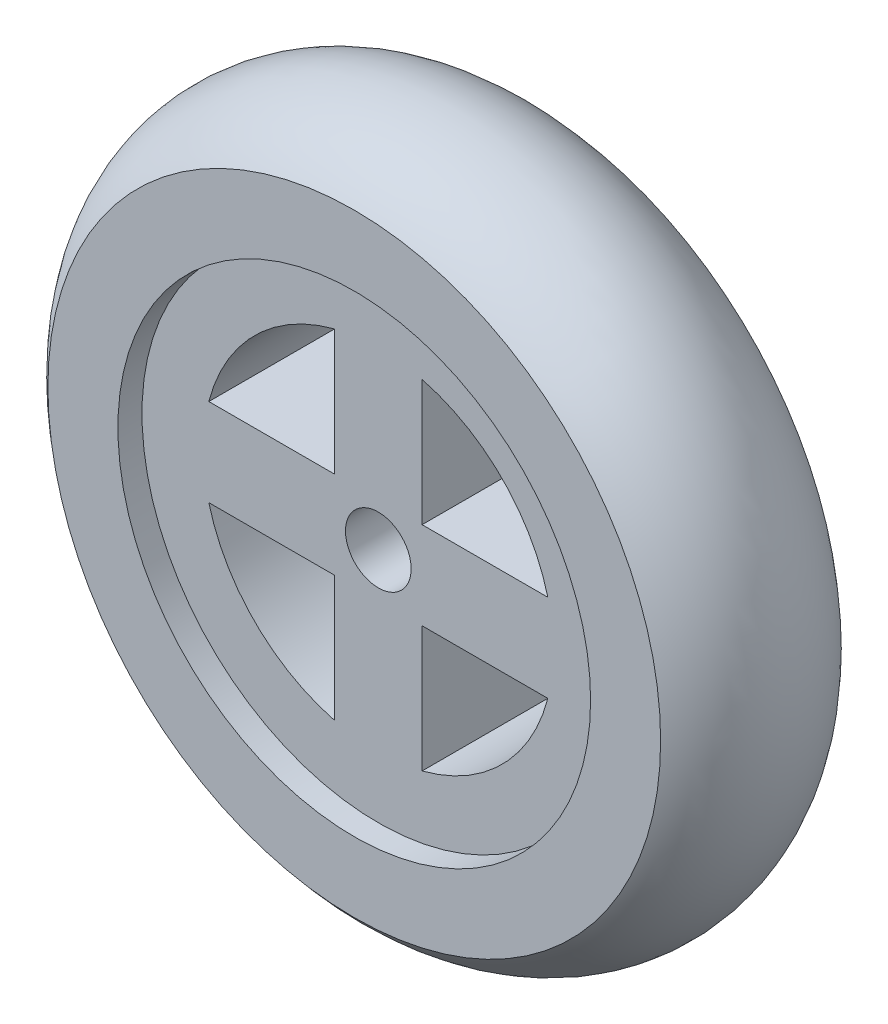
ISO-10303-21;
HEADER;
FILE_DESCRIPTION(('STEP AP214'),'2;1');
FILE_NAME('part.step','',(''),(''),'','','');
FILE_SCHEMA(('AUTOMOTIVE_DESIGN { 1 0 10303 214 1 1 1 1 }'));
ENDSEC;
DATA;
#1=APPLICATION_CONTEXT('core data for automotive mechanical design processes');
#2=APPLICATION_PROTOCOL_DEFINITION('international standard','automotive_design',2000,#1);
#3=PRODUCT_CONTEXT('',#1,'mechanical');
#4=PRODUCT('Part','Part','',(#3));
#5=PRODUCT_RELATED_PRODUCT_CATEGORY('part','',(#4));
#6=PRODUCT_DEFINITION_FORMATION('','',#4);
#7=PRODUCT_DEFINITION_CONTEXT('part definition',#1,'design');
#8=PRODUCT_DEFINITION('design','',#6,#7);
#9=PRODUCT_DEFINITION_SHAPE('','',#8);
#10=(LENGTH_UNIT() NAMED_UNIT(*) SI_UNIT(.MILLI.,.METRE.));
#11=(NAMED_UNIT(*) PLANE_ANGLE_UNIT() SI_UNIT($,.RADIAN.));
#12=(NAMED_UNIT(*) SI_UNIT($,.STERADIAN.) SOLID_ANGLE_UNIT());
#13=UNCERTAINTY_MEASURE_WITH_UNIT(LENGTH_MEASURE(1.E-05),#10,'distance_accuracy_value','');
#14=(GEOMETRIC_REPRESENTATION_CONTEXT(3) GLOBAL_UNCERTAINTY_ASSIGNED_CONTEXT((#13)) GLOBAL_UNIT_ASSIGNED_CONTEXT((#10,
#11,#12)) REPRESENTATION_CONTEXT('',''));
#15=CARTESIAN_POINT('',(0.,0.,0.));
#16=DIRECTION('',(0.,0.,1.));
#17=DIRECTION('',(1.,0.,0.));
#18=AXIS2_PLACEMENT_3D('',#15,#16,#17);
#19=CARTESIAN_POINT('',(2.54688017204094E-12,0.,729.455473155936));
#20=DIRECTION('',(0.,0.,1.));
#21=DIRECTION('',(1.,0.,0.));
#22=AXIS2_PLACEMENT_3D('',#19,#20,#21);
#23=CYLINDRICAL_SURFACE('',#22,40.);
#24=CARTESIAN_POINT('',(0.,0.,15.0000000000001));
#25=DIRECTION('',(0.,0.,1.));
#26=DIRECTION('',(1.,0.,0.));
#27=AXIS2_PLACEMENT_3D('',#24,#25,#26);
#28=CIRCLE('',#27,39.9999999999999);
#29=CARTESIAN_POINT('',(38.7298334620742,10.,15.));
#30=VERTEX_POINT('',#29);
#31=CARTESIAN_POINT('',(9.99999999999993,38.7298334620741,15.0000000000001));
#32=VERTEX_POINT('',#31);
#33=EDGE_CURVE('E130',#30,#32,#28,.T.);
#34=ORIENTED_EDGE('',*,*,#33,.T.);
#35=DIRECTION('',(0.,0.,1.));
#36=VECTOR('',#35,1.);
#37=CARTESIAN_POINT('',(10.0000000000024,38.7298334620742,729.455473155936));
#38=LINE('',#37,#36);
#39=CARTESIAN_POINT('',(9.99999999999982,38.7298334620743,-14.9999999999999));
#40=VERTEX_POINT('',#39);
#41=EDGE_CURVE('E165',#32,#40,#38,.F.);
#42=ORIENTED_EDGE('',*,*,#41,.T.);
#43=CARTESIAN_POINT('',(0.,0.,-14.9999999999999));
#44=DIRECTION('',(0.,0.,1.));
#45=DIRECTION('',(1.,0.,0.));
#46=AXIS2_PLACEMENT_3D('',#43,#44,#45);
#47=CIRCLE('',#46,40.0000000000001);
#48=CARTESIAN_POINT('',(38.7298334620742,10.,-15.));
#49=VERTEX_POINT('',#48);
#50=EDGE_CURVE('E212',#49,#40,#47,.T.);
#51=ORIENTED_EDGE('',*,*,#50,.F.);
#52=DIRECTION('',(0.,0.,1.));
#53=VECTOR('',#52,1.);
#54=CARTESIAN_POINT('',(38.7298334620767,10.,729.455473155935));
#55=LINE('',#54,#53);
#56=EDGE_CURVE('E188',#49,#30,#55,.T.);
#57=ORIENTED_EDGE('',*,*,#56,.T.);
#58=EDGE_LOOP('',(#34,#42,#51,#57));
#59=FACE_BOUND('',#58,.T.);
#60=ADVANCED_FACE('F32',(#59),#23,.F.);
#61=CARTESIAN_POINT('',(10.0000000000001,-38.7298334620742,-14.9999999999999));
#62=VERTEX_POINT('',#61);
#63=CARTESIAN_POINT('',(38.7298334620742,-10.,-15.));
#64=VERTEX_POINT('',#63);
#65=EDGE_CURVE('E48',#62,#64,#47,.T.);
#66=ORIENTED_EDGE('',*,*,#65,.F.);
#67=DIRECTION('',(0.,0.,1.));
#68=VECTOR('',#67,1.);
#69=CARTESIAN_POINT('',(10.0000000000027,-38.7298334620741,729.455473155936));
#70=LINE('',#69,#68);
#71=CARTESIAN_POINT('',(10.0000000000002,-38.7298334620741,15.0000000000001));
#72=VERTEX_POINT('',#71);
#73=EDGE_CURVE('E163',#62,#72,#70,.T.);
#74=ORIENTED_EDGE('',*,*,#73,.T.);
#75=CARTESIAN_POINT('',(38.7298334620742,-10.,15.));
#76=VERTEX_POINT('',#75);
#77=EDGE_CURVE('E128',#72,#76,#28,.T.);
#78=ORIENTED_EDGE('',*,*,#77,.T.);
#79=DIRECTION('',(0.,0.,1.));
#80=VECTOR('',#79,1.);
#81=CARTESIAN_POINT('',(38.7298334620767,-10.,729.455473155935));
#82=LINE('',#81,#80);
#83=EDGE_CURVE('E182',#64,#76,#82,.T.);
#84=ORIENTED_EDGE('',*,*,#83,.F.);
#85=EDGE_LOOP('',(#66,#74,#78,#84));
#86=FACE_BOUND('',#85,.T.);
#87=ADVANCED_FACE('F226',(#86),#23,.F.);
#88=CARTESIAN_POINT('',(0.,10.,0.));
#89=DIRECTION('',(0.,-1.,0.));
#90=DIRECTION('',(0.,0.,-1.));
#91=AXIS2_PLACEMENT_3D('',#88,#89,#90);
#92=PLANE('',#91);
#93=DIRECTION('',(0.,0.,-1.));
#94=VECTOR('',#93,1.);
#95=CARTESIAN_POINT('',(9.99999999999997,10.,0.));
#96=LINE('',#95,#94);
#97=CARTESIAN_POINT('',(10.,10.,15.0000000000001));
#98=VERTEX_POINT('',#97);
#99=CARTESIAN_POINT('',(9.99999999999991,10.,-14.9999999999999));
#100=VERTEX_POINT('',#99);
#101=EDGE_CURVE('E161',#98,#100,#96,.T.);
#102=ORIENTED_EDGE('',*,*,#101,.F.);
#103=DIRECTION('',(1.,0.,0.));
#104=VECTOR('',#103,1.);
#105=CARTESIAN_POINT('',(40.0000000000001,10.,15.));
#106=LINE('',#105,#104);
#107=EDGE_CURVE('E172',#98,#30,#106,.T.);
#108=ORIENTED_EDGE('',*,*,#107,.T.);
#109=ORIENTED_EDGE('',*,*,#56,.F.);
#110=DIRECTION('',(-1.,0.,0.));
#111=VECTOR('',#110,1.);
#112=CARTESIAN_POINT('',(-40.0000000000001,10.,-14.9999999999998));
#113=LINE('',#112,#111);
#114=EDGE_CURVE('E173',#49,#100,#113,.T.);
#115=ORIENTED_EDGE('',*,*,#114,.T.);
#116=EDGE_LOOP('',(#102,#108,#109,#115));
#117=FACE_BOUND('',#116,.T.);
#118=ADVANCED_FACE('F303',(#117),#92,.F.);
#119=CARTESIAN_POINT('',(0.,-10.,0.));
#120=DIRECTION('',(0.,-1.,0.));
#121=DIRECTION('',(0.,0.,-1.));
#122=AXIS2_PLACEMENT_3D('',#119,#120,#121);
#123=PLANE('',#122);
#124=DIRECTION('',(1.,0.,0.));
#125=VECTOR('',#124,1.);
#126=CARTESIAN_POINT('',(40.0000000000001,-10.,15.));
#127=LINE('',#126,#125);
#128=CARTESIAN_POINT('',(10.,-10.,15.0000000000001));
#129=VERTEX_POINT('',#128);
#130=EDGE_CURVE('E167',#129,#76,#127,.T.);
#131=ORIENTED_EDGE('',*,*,#130,.F.);
#132=DIRECTION('',(0.,0.,-1.));
#133=VECTOR('',#132,1.);
#134=CARTESIAN_POINT('',(10.,-10.,0.));
#135=LINE('',#134,#133);
#136=CARTESIAN_POINT('',(10.,-10.,-14.9999999999999));
#137=VERTEX_POINT('',#136);
#138=EDGE_CURVE('E11',#129,#137,#135,.T.);
#139=ORIENTED_EDGE('',*,*,#138,.T.);
#140=DIRECTION('',(-1.,0.,0.));
#141=VECTOR('',#140,1.);
#142=CARTESIAN_POINT('',(-40.0000000000001,-10.,-14.9999999999998));
#143=LINE('',#142,#141);
#144=EDGE_CURVE('E178',#64,#137,#143,.T.);
#145=ORIENTED_EDGE('',*,*,#144,.F.);
#146=ORIENTED_EDGE('',*,*,#83,.T.);
#147=EDGE_LOOP('',(#131,#139,#145,#146));
#148=FACE_BOUND('',#147,.T.);
#149=ADVANCED_FACE('F230',(#148),#123,.T.);
#150=DIRECTION('',(0.,0.,1.));
#151=VECTOR('',#150,1.);
#152=CARTESIAN_POINT('',(-9.99999999999758,38.7298334620741,729.455473155936));
#153=LINE('',#152,#151);
#154=CARTESIAN_POINT('',(-10.0000000000001,38.7298334620741,15.0000000000002));
#155=VERTEX_POINT('',#154);
#156=CARTESIAN_POINT('',(-10.0000000000002,38.7298334620742,-14.9999999999998));
#157=VERTEX_POINT('',#156);
#158=EDGE_CURVE('E139',#155,#157,#153,.F.);
#159=ORIENTED_EDGE('',*,*,#158,.F.);
#160=CARTESIAN_POINT('',(-38.7298334620741,10.,15.0000000000003));
#161=VERTEX_POINT('',#160);
#162=EDGE_CURVE('E127',#155,#161,#28,.T.);
#163=ORIENTED_EDGE('',*,*,#162,.T.);
#164=DIRECTION('',(0.,0.,1.));
#165=VECTOR('',#164,1.);
#166=CARTESIAN_POINT('',(-38.7298334620716,10.,729.455473155936));
#167=LINE('',#166,#165);
#168=CARTESIAN_POINT('',(-38.7298334620743,10.,-14.9999999999998));
#169=VERTEX_POINT('',#168);
#170=EDGE_CURVE('E185',#161,#169,#167,.F.);
#171=ORIENTED_EDGE('',*,*,#170,.T.);
#172=EDGE_CURVE('E211',#157,#169,#47,.T.);
#173=ORIENTED_EDGE('',*,*,#172,.F.);
#174=EDGE_LOOP('',(#159,#163,#171,#173));
#175=FACE_BOUND('',#174,.T.);
#176=ADVANCED_FACE('F304',(#175),#23,.F.);
#177=DIRECTION('',(0.,0.,1.));
#178=VECTOR('',#177,1.);
#179=CARTESIAN_POINT('',(-9.99999999999732,-38.7298334620742,729.455473155936));
#180=LINE('',#179,#178);
#181=CARTESIAN_POINT('',(-9.99999999999993,-38.7298334620743,-14.9999999999999));
#182=VERTEX_POINT('',#181);
#183=CARTESIAN_POINT('',(-9.99999999999981,-38.7298334620741,15.0000000000002));
#184=VERTEX_POINT('',#183);
#185=EDGE_CURVE('E56',#182,#184,#180,.T.);
#186=ORIENTED_EDGE('',*,*,#185,.F.);
#187=CARTESIAN_POINT('',(-38.7298334620743,-10.,-14.9999999999998));
#188=VERTEX_POINT('',#187);
#189=EDGE_CURVE('E209',#188,#182,#47,.T.);
#190=ORIENTED_EDGE('',*,*,#189,.F.);
#191=DIRECTION('',(0.,0.,1.));
#192=VECTOR('',#191,1.);
#193=CARTESIAN_POINT('',(-38.7298334620716,-10.,729.455473155936));
#194=LINE('',#193,#192);
#195=CARTESIAN_POINT('',(-38.7298334620741,-10.,15.0000000000003));
#196=VERTEX_POINT('',#195);
#197=EDGE_CURVE('E122',#196,#188,#194,.F.);
#198=ORIENTED_EDGE('',*,*,#197,.F.);
#199=EDGE_CURVE('E120',#196,#184,#28,.T.);
#200=ORIENTED_EDGE('',*,*,#199,.T.);
#201=EDGE_LOOP('',(#186,#190,#198,#200));
#202=FACE_BOUND('',#201,.T.);
#203=ADVANCED_FACE('F34',(#202),#23,.F.);
#204=CARTESIAN_POINT('',(40.,0.,-15.));
#205=DIRECTION('',(0.,0.,-1.));
#206=DIRECTION('',(-1.,0.,0.));
#207=AXIS2_PLACEMENT_3D('',#204,#205,#206);
#208=PLANE('',#207);
#209=CARTESIAN_POINT('',(0.,0.,-14.9999999999998));
#210=DIRECTION('',(0.,0.,-1.));
#211=DIRECTION('',(-1.,0.,0.));
#212=AXIS2_PLACEMENT_3D('',#209,#210,#211);
#213=CIRCLE('',#212,7.5);
#214=CARTESIAN_POINT('',(-7.50000000000005,0.,-14.9999999999998));
#215=VERTEX_POINT('',#214);
#216=EDGE_CURVE('E240',#215,#215,#213,.T.);
#217=ORIENTED_EDGE('',*,*,#216,.F.);
#218=EDGE_LOOP('',(#217));
#219=FACE_BOUND('',#218,.T.);
#220=ORIENTED_EDGE('',*,*,#50,.T.);
#221=DIRECTION('',(0.,-1.,0.));
#222=VECTOR('',#221,1.);
#223=CARTESIAN_POINT('',(10.0000000000001,-40.,-15.));
#224=LINE('',#223,#222);
#225=EDGE_CURVE('E149',#40,#100,#224,.T.);
#226=ORIENTED_EDGE('',*,*,#225,.T.);
#227=ORIENTED_EDGE('',*,*,#114,.F.);
#228=EDGE_LOOP('',(#220,#226,#227));
#229=FACE_BOUND('',#228,.T.);
#230=ORIENTED_EDGE('',*,*,#189,.T.);
#231=DIRECTION('',(0.,-1.,0.));
#232=VECTOR('',#231,1.);
#233=CARTESIAN_POINT('',(-9.99999999999991,-40.,-14.9999999999999));
#234=LINE('',#233,#232);
#235=CARTESIAN_POINT('',(-10.,-10.,-14.9999999999999));
#236=VERTEX_POINT('',#235);
#237=EDGE_CURVE('E138',#236,#182,#234,.T.);
#238=ORIENTED_EDGE('',*,*,#237,.F.);
#239=EDGE_CURVE('E177',#236,#188,#143,.T.);
#240=ORIENTED_EDGE('',*,*,#239,.T.);
#241=EDGE_LOOP('',(#230,#238,#240));
#242=FACE_BOUND('',#241,.T.);
#243=EDGE_CURVE('E145',#137,#62,#224,.T.);
#244=ORIENTED_EDGE('',*,*,#243,.T.);
#245=ORIENTED_EDGE('',*,*,#65,.T.);
#246=ORIENTED_EDGE('',*,*,#144,.T.);
#247=EDGE_LOOP('',(#244,#245,#246));
#248=FACE_BOUND('',#247,.T.);
#249=CARTESIAN_POINT('',(-10.,10.,-14.9999999999999));
#250=VERTEX_POINT('',#249);
#251=EDGE_CURVE('E152',#157,#250,#234,.T.);
#252=ORIENTED_EDGE('',*,*,#251,.F.);
#253=ORIENTED_EDGE('',*,*,#172,.T.);
#254=EDGE_CURVE('E171',#250,#169,#113,.T.);
#255=ORIENTED_EDGE('',*,*,#254,.F.);
#256=EDGE_LOOP('',(#252,#253,#255));
#257=FACE_BOUND('',#256,.T.);
#258=CARTESIAN_POINT('',(0.,0.,-14.9999999999998));
#259=DIRECTION('',(0.,0.,1.));
#260=DIRECTION('',(1.,0.,0.));
#261=AXIS2_PLACEMENT_3D('',#258,#259,#260);
#262=CIRCLE('',#261,54.0000000000001);
#263=CARTESIAN_POINT('',(54.,0.,-15.));
#264=VERTEX_POINT('',#263);
#265=EDGE_CURVE('E206',#264,#264,#262,.T.);
#266=ORIENTED_EDGE('',*,*,#265,.F.);
#267=EDGE_LOOP('',(#266));
#268=FACE_BOUND('',#267,.T.);
#269=ADVANCED_FACE('F223',(#219,#229,#242,#248,#257,#268),#208,.T.);
#270=CARTESIAN_POINT('',(2.54688017204094E-12,0.,729.455473155936));
#271=DIRECTION('',(0.,0.,1.));
#272=DIRECTION('',(1.,0.,0.));
#273=AXIS2_PLACEMENT_3D('',#270,#271,#272);
#274=CYLINDRICAL_SURFACE('',#273,54.0000000000001);
#275=ORIENTED_EDGE('',*,*,#265,.T.);
#276=EDGE_LOOP('',(#275));
#277=FACE_BOUND('',#276,.T.);
#278=CARTESIAN_POINT('',(0.,0.,-20.4999999999997));
#279=DIRECTION('',(0.,0.,1.));
#280=DIRECTION('',(1.,0.,0.));
#281=AXIS2_PLACEMENT_3D('',#278,#279,#280);
#282=CIRCLE('',#281,54.0000000000001);
#283=CARTESIAN_POINT('',(54.,0.,-20.4999999999999));
#284=VERTEX_POINT('',#283);
#285=EDGE_CURVE('E203',#284,#284,#282,.T.);
#286=ORIENTED_EDGE('',*,*,#285,.F.);
#287=EDGE_LOOP('',(#286));
#288=FACE_BOUND('',#287,.T.);
#289=ADVANCED_FACE('F264',(#277,#288),#274,.F.);
#290=CARTESIAN_POINT('',(54.,0.,-20.5));
#291=DIRECTION('',(0.,0.,-1.));
#292=DIRECTION('',(-1.,0.,0.));
#293=AXIS2_PLACEMENT_3D('',#290,#291,#292);
#294=PLANE('',#293);
#295=ORIENTED_EDGE('',*,*,#285,.T.);
#296=EDGE_LOOP('',(#295));
#297=FACE_BOUND('',#296,.T.);
#298=CARTESIAN_POINT('',(0.,0.,-20.4999999999997));
#299=DIRECTION('',(0.,0.,1.));
#300=DIRECTION('',(1.,0.,0.));
#301=AXIS2_PLACEMENT_3D('',#298,#299,#300);
#302=CIRCLE('',#301,70.0000000000001);
#303=CARTESIAN_POINT('',(70.,0.,-20.5));
#304=VERTEX_POINT('',#303);
#305=EDGE_CURVE('E200',#304,#304,#302,.T.);
#306=ORIENTED_EDGE('',*,*,#305,.F.);
#307=EDGE_LOOP('',(#306));
#308=FACE_BOUND('',#307,.T.);
#309=ADVANCED_FACE('F270',(#297,#308),#294,.T.);
#310=CARTESIAN_POINT('',(0.,0.,2.22044604925031E-13));
#311=DIRECTION('',(0.,0.,1.));
#312=DIRECTION('',(1.,0.,0.));
#313=AXIS2_PLACEMENT_3D('',#310,#311,#312);
#314=TOROIDAL_SURFACE('',#313,54.0078144082805,26.);
#315=ORIENTED_EDGE('',*,*,#305,.T.);
#316=EDGE_LOOP('',(#315));
#317=FACE_BOUND('',#316,.T.);
#318=CARTESIAN_POINT('',(0.,0.,20.5000000000002));
#319=DIRECTION('',(0.,0.,1.));
#320=DIRECTION('',(1.,0.,0.));
#321=AXIS2_PLACEMENT_3D('',#318,#319,#320);
#322=CIRCLE('',#321,69.9999999999999);
#323=CARTESIAN_POINT('',(70.,0.,20.4999999999999));
#324=VERTEX_POINT('',#323);
#325=EDGE_CURVE('E197',#324,#324,#322,.T.);
#326=ORIENTED_EDGE('',*,*,#325,.F.);
#327=EDGE_LOOP('',(#326));
#328=FACE_BOUND('',#327,.T.);
#329=ADVANCED_FACE('F276',(#317,#328),#314,.T.);
#330=CARTESIAN_POINT('',(54.,0.,20.5));
#331=DIRECTION('',(0.,0.,1.));
#332=DIRECTION('',(1.,0.,0.));
#333=AXIS2_PLACEMENT_3D('',#330,#331,#332);
#334=PLANE('',#333);
#335=ORIENTED_EDGE('',*,*,#325,.T.);
#336=EDGE_LOOP('',(#335));
#337=FACE_BOUND('',#336,.T.);
#338=CARTESIAN_POINT('',(0.,0.,20.5000000000002));
#339=DIRECTION('',(0.,0.,1.));
#340=DIRECTION('',(1.,0.,0.));
#341=AXIS2_PLACEMENT_3D('',#338,#339,#340);
#342=CIRCLE('',#341,53.9999999999999);
#343=CARTESIAN_POINT('',(54.,0.,20.5));
#344=VERTEX_POINT('',#343);
#345=EDGE_CURVE('E194',#344,#344,#342,.T.);
#346=ORIENTED_EDGE('',*,*,#345,.F.);
#347=EDGE_LOOP('',(#346));
#348=FACE_BOUND('',#347,.T.);
#349=ADVANCED_FACE('F282',(#337,#348),#334,.T.);
#350=CARTESIAN_POINT('',(2.54688017204094E-12,0.,729.455473155936));
#351=DIRECTION('',(0.,0.,1.));
#352=DIRECTION('',(1.,0.,0.));
#353=AXIS2_PLACEMENT_3D('',#350,#351,#352);
#354=CYLINDRICAL_SURFACE('',#353,53.9999999999999);
#355=ORIENTED_EDGE('',*,*,#345,.T.);
#356=EDGE_LOOP('',(#355));
#357=FACE_BOUND('',#356,.T.);
#358=CARTESIAN_POINT('',(0.,0.,15.0000000000002));
#359=DIRECTION('',(0.,0.,1.));
#360=DIRECTION('',(1.,0.,0.));
#361=AXIS2_PLACEMENT_3D('',#358,#359,#360);
#362=CIRCLE('',#361,53.9999999999999);
#363=CARTESIAN_POINT('',(54.,0.,15.));
#364=VERTEX_POINT('',#363);
#365=EDGE_CURVE('E191',#364,#364,#362,.T.);
#366=ORIENTED_EDGE('',*,*,#365,.F.);
#367=EDGE_LOOP('',(#366));
#368=FACE_BOUND('',#367,.T.);
#369=ADVANCED_FACE('F252',(#357,#368),#354,.F.);
#370=CARTESIAN_POINT('',(40.,0.,15.));
#371=DIRECTION('',(0.,0.,1.));
#372=DIRECTION('',(1.,0.,0.));
#373=AXIS2_PLACEMENT_3D('',#370,#371,#372);
#374=PLANE('',#373);
#375=CARTESIAN_POINT('',(0.,0.,15.0000000000002));
#376=DIRECTION('',(0.,0.,1.));
#377=DIRECTION('',(1.,0.,0.));
#378=AXIS2_PLACEMENT_3D('',#375,#376,#377);
#379=CIRCLE('',#378,7.5);
#380=CARTESIAN_POINT('',(-7.49999999999995,0.,15.0000000000002));
#381=VERTEX_POINT('',#380);
#382=EDGE_CURVE('E36',#381,#381,#379,.T.);
#383=ORIENTED_EDGE('',*,*,#382,.F.);
#384=EDGE_LOOP('',(#383));
#385=FACE_BOUND('',#384,.T.);
#386=ORIENTED_EDGE('',*,*,#162,.F.);
#387=DIRECTION('',(0.,1.,0.));
#388=VECTOR('',#387,1.);
#389=CARTESIAN_POINT('',(-10.0000000000001,40.,15.0000000000002));
#390=LINE('',#389,#388);
#391=CARTESIAN_POINT('',(-9.99999999999998,10.,15.0000000000002));
#392=VERTEX_POINT('',#391);
#393=EDGE_CURVE('E146',#392,#155,#390,.T.);
#394=ORIENTED_EDGE('',*,*,#393,.F.);
#395=EDGE_CURVE('E168',#161,#392,#106,.T.);
#396=ORIENTED_EDGE('',*,*,#395,.F.);
#397=EDGE_LOOP('',(#386,#394,#396));
#398=FACE_BOUND('',#397,.T.);
#399=ORIENTED_EDGE('',*,*,#77,.F.);
#400=DIRECTION('',(0.,1.,0.));
#401=VECTOR('',#400,1.);
#402=CARTESIAN_POINT('',(9.99999999999991,40.,15.0000000000001));
#403=LINE('',#402,#401);
#404=EDGE_CURVE('E157',#72,#129,#403,.T.);
#405=ORIENTED_EDGE('',*,*,#404,.T.);
#406=ORIENTED_EDGE('',*,*,#130,.T.);
#407=EDGE_LOOP('',(#399,#405,#406));
#408=FACE_BOUND('',#407,.T.);
#409=CARTESIAN_POINT('',(-9.99999999999997,-10.,15.0000000000002));
#410=VERTEX_POINT('',#409);
#411=EDGE_CURVE('E136',#184,#410,#390,.T.);
#412=ORIENTED_EDGE('',*,*,#411,.F.);
#413=ORIENTED_EDGE('',*,*,#199,.F.);
#414=EDGE_CURVE('E144',#196,#410,#127,.T.);
#415=ORIENTED_EDGE('',*,*,#414,.T.);
#416=EDGE_LOOP('',(#412,#413,#415));
#417=FACE_BOUND('',#416,.T.);
#418=EDGE_CURVE('E237',#98,#32,#403,.T.);
#419=ORIENTED_EDGE('',*,*,#418,.T.);
#420=ORIENTED_EDGE('',*,*,#33,.F.);
#421=ORIENTED_EDGE('',*,*,#107,.F.);
#422=EDGE_LOOP('',(#419,#420,#421));
#423=FACE_BOUND('',#422,.T.);
#424=ORIENTED_EDGE('',*,*,#365,.T.);
#425=EDGE_LOOP('',(#424));
#426=FACE_BOUND('',#425,.T.);
#427=ADVANCED_FACE('F142',(#385,#398,#408,#417,#423,#426),#374,.T.);
#428=ORIENTED_EDGE('',*,*,#395,.T.);
#429=DIRECTION('',(0.,0.,-1.));
#430=VECTOR('',#429,1.);
#431=CARTESIAN_POINT('',(-10.,10.,0.));
#432=LINE('',#431,#430);
#433=EDGE_CURVE('E140',#392,#250,#432,.T.);
#434=ORIENTED_EDGE('',*,*,#433,.T.);
#435=ORIENTED_EDGE('',*,*,#254,.T.);
#436=ORIENTED_EDGE('',*,*,#170,.F.);
#437=EDGE_LOOP('',(#428,#434,#435,#436));
#438=FACE_BOUND('',#437,.T.);
#439=ADVANCED_FACE('F251',(#438),#92,.F.);
#440=DIRECTION('',(0.,0.,-1.));
#441=VECTOR('',#440,1.);
#442=CARTESIAN_POINT('',(-9.99999999999997,-10.,0.));
#443=LINE('',#442,#441);
#444=EDGE_CURVE('E41',#410,#236,#443,.T.);
#445=ORIENTED_EDGE('',*,*,#444,.F.);
#446=ORIENTED_EDGE('',*,*,#414,.F.);
#447=ORIENTED_EDGE('',*,*,#197,.T.);
#448=ORIENTED_EDGE('',*,*,#239,.F.);
#449=EDGE_LOOP('',(#445,#446,#447,#448));
#450=FACE_BOUND('',#449,.T.);
#451=ADVANCED_FACE('F313',(#450),#123,.T.);
#452=CARTESIAN_POINT('',(10.,0.,0.));
#453=DIRECTION('',(-1.,0.,0.));
#454=DIRECTION('',(0.,0.,-1.));
#455=AXIS2_PLACEMENT_3D('',#452,#453,#454);
#456=PLANE('',#455);
#457=ORIENTED_EDGE('',*,*,#73,.F.);
#458=ORIENTED_EDGE('',*,*,#243,.F.);
#459=ORIENTED_EDGE('',*,*,#138,.F.);
#460=ORIENTED_EDGE('',*,*,#404,.F.);
#461=EDGE_LOOP('',(#457,#458,#459,#460));
#462=FACE_BOUND('',#461,.T.);
#463=ADVANCED_FACE('F235',(#462),#456,.F.);
#464=CARTESIAN_POINT('',(-10.,0.,0.));
#465=DIRECTION('',(-1.,0.,0.));
#466=DIRECTION('',(0.,0.,-1.));
#467=AXIS2_PLACEMENT_3D('',#464,#465,#466);
#468=PLANE('',#467);
#469=ORIENTED_EDGE('',*,*,#237,.T.);
#470=ORIENTED_EDGE('',*,*,#185,.T.);
#471=ORIENTED_EDGE('',*,*,#411,.T.);
#472=ORIENTED_EDGE('',*,*,#444,.T.);
#473=EDGE_LOOP('',(#469,#470,#471,#472));
#474=FACE_BOUND('',#473,.T.);
#475=ADVANCED_FACE('F134',(#474),#468,.T.);
#476=ORIENTED_EDGE('',*,*,#41,.F.);
#477=ORIENTED_EDGE('',*,*,#418,.F.);
#478=ORIENTED_EDGE('',*,*,#101,.T.);
#479=ORIENTED_EDGE('',*,*,#225,.F.);
#480=EDGE_LOOP('',(#476,#477,#478,#479));
#481=FACE_BOUND('',#480,.T.);
#482=ADVANCED_FACE('F326',(#481),#456,.F.);
#483=ORIENTED_EDGE('',*,*,#393,.T.);
#484=ORIENTED_EDGE('',*,*,#158,.T.);
#485=ORIENTED_EDGE('',*,*,#251,.T.);
#486=ORIENTED_EDGE('',*,*,#433,.F.);
#487=EDGE_LOOP('',(#483,#484,#485,#486));
#488=FACE_BOUND('',#487,.T.);
#489=ADVANCED_FACE('F260',(#488),#468,.T.);
#490=CARTESIAN_POINT('',(0.,0.,20.5000000000003));
#491=DIRECTION('',(0.,0.,-1.));
#492=DIRECTION('',(-1.,0.,0.));
#493=AXIS2_PLACEMENT_3D('',#490,#491,#492);
#494=CYLINDRICAL_SURFACE('',#493,7.5);
#495=CARTESIAN_POINT('',(-7.50000000000005,0.,-14.9999999999998));
#496=CARTESIAN_POINT('',(-7.50000000000005,0.,-14.6874999999998));
#497=CARTESIAN_POINT('',(-7.50000000000005,0.,-14.3749999999998));
#498=CARTESIAN_POINT('',(-7.50000000000005,0.,-13.7499999999998));
#499=CARTESIAN_POINT('',(-7.50000000000005,0.,-13.4374999999998));
#500=CARTESIAN_POINT('',(-7.50000000000004,0.,-12.8124999999998));
#501=CARTESIAN_POINT('',(-7.50000000000004,0.,-12.4999999999998));
#502=CARTESIAN_POINT('',(-7.50000000000004,0.,-11.8749999999998));
#503=CARTESIAN_POINT('',(-7.50000000000004,0.,-11.5624999999998));
#504=CARTESIAN_POINT('',(-7.50000000000004,0.,-10.9374999999998));
#505=CARTESIAN_POINT('',(-7.50000000000004,0.,-10.6249999999998));
#506=CARTESIAN_POINT('',(-7.50000000000003,0.,-9.99999999999981));
#507=CARTESIAN_POINT('',(-7.50000000000003,0.,-9.68749999999981));
#508=CARTESIAN_POINT('',(-7.50000000000003,0.,-9.06249999999981));
#509=CARTESIAN_POINT('',(-7.50000000000003,0.,-8.74999999999981));
#510=CARTESIAN_POINT('',(-7.50000000000003,0.,-8.12499999999981));
#511=CARTESIAN_POINT('',(-7.50000000000003,0.,-7.81249999999981));
#512=CARTESIAN_POINT('',(-7.50000000000002,0.,-7.18749999999981));
#513=CARTESIAN_POINT('',(-7.50000000000002,0.,-6.87499999999981));
#514=CARTESIAN_POINT('',(-7.50000000000002,0.,-6.24999999999981));
#515=CARTESIAN_POINT('',(-7.50000000000002,0.,-5.93749999999981));
#516=CARTESIAN_POINT('',(-7.50000000000002,0.,-5.31249999999981));
#517=CARTESIAN_POINT('',(-7.50000000000002,0.,-4.99999999999981));
#518=CARTESIAN_POINT('',(-7.50000000000001,0.,-4.37499999999981));
#519=CARTESIAN_POINT('',(-7.50000000000001,0.,-4.06249999999981));
#520=CARTESIAN_POINT('',(-7.50000000000001,0.,-3.43749999999981));
#521=CARTESIAN_POINT('',(-7.50000000000001,0.,-3.12499999999981));
#522=CARTESIAN_POINT('',(-7.50000000000001,0.,-2.49999999999981));
#523=CARTESIAN_POINT('',(-7.50000000000001,0.,-2.18749999999981));
#524=CARTESIAN_POINT('',(-7.50000000000001,0.,-1.56249999999981));
#525=CARTESIAN_POINT('',(-7.5,0.,-1.24999999999981));
#526=CARTESIAN_POINT('',(-7.5,0.,-0.62499999999981));
#527=CARTESIAN_POINT('',(-7.5,0.,-0.312499999999809));
#528=CARTESIAN_POINT('',(-7.5,0.,0.312500000000191));
#529=CARTESIAN_POINT('',(-7.5,0.,0.625000000000191));
#530=CARTESIAN_POINT('',(-7.5,0.,1.25000000000019));
#531=CARTESIAN_POINT('',(-7.49999999999999,0.,1.56250000000019));
#532=CARTESIAN_POINT('',(-7.49999999999999,0.,2.18750000000019));
#533=CARTESIAN_POINT('',(-7.49999999999999,0.,2.50000000000019));
#534=CARTESIAN_POINT('',(-7.49999999999999,0.,3.12500000000019));
#535=CARTESIAN_POINT('',(-7.49999999999999,0.,3.43750000000019));
#536=CARTESIAN_POINT('',(-7.49999999999998,0.,4.06250000000019));
#537=CARTESIAN_POINT('',(-7.49999999999998,0.,4.37500000000019));
#538=CARTESIAN_POINT('',(-7.49999999999998,0.,5.00000000000019));
#539=CARTESIAN_POINT('',(-7.49999999999998,0.,5.31250000000019));
#540=CARTESIAN_POINT('',(-7.49999999999998,0.,5.93750000000019));
#541=CARTESIAN_POINT('',(-7.49999999999998,0.,6.25000000000019));
#542=CARTESIAN_POINT('',(-7.49999999999998,0.,6.87500000000019));
#543=CARTESIAN_POINT('',(-7.49999999999997,0.,7.18750000000019));
#544=CARTESIAN_POINT('',(-7.49999999999997,0.,7.81250000000019));
#545=CARTESIAN_POINT('',(-7.49999999999997,0.,8.12500000000019));
#546=CARTESIAN_POINT('',(-7.49999999999997,0.,8.75000000000019));
#547=CARTESIAN_POINT('',(-7.49999999999997,0.,9.06250000000019));
#548=CARTESIAN_POINT('',(-7.49999999999997,0.,9.68750000000019));
#549=CARTESIAN_POINT('',(-7.49999999999996,0.,10.0000000000002));
#550=CARTESIAN_POINT('',(-7.49999999999996,0.,10.6250000000002));
#551=CARTESIAN_POINT('',(-7.49999999999996,0.,10.9375000000002));
#552=CARTESIAN_POINT('',(-7.49999999999996,0.,11.5625000000002));
#553=CARTESIAN_POINT('',(-7.49999999999996,0.,11.8750000000002));
#554=CARTESIAN_POINT('',(-7.49999999999996,0.,12.5000000000002));
#555=CARTESIAN_POINT('',(-7.49999999999995,0.,12.8125000000002));
#556=CARTESIAN_POINT('',(-7.49999999999995,0.,13.4375000000002));
#557=CARTESIAN_POINT('',(-7.49999999999995,0.,13.7500000000002));
#558=CARTESIAN_POINT('',(-7.49999999999995,0.,14.3750000000002));
#559=CARTESIAN_POINT('',(-7.49999999999995,0.,14.6875000000002));
#560=CARTESIAN_POINT('',(-7.49999999999995,0.,15.0000000000002));
#561=B_SPLINE_CURVE_WITH_KNOTS('',3,(#495,#496,#497,#498,#499,#500,#501,#502,#503,#504,#505,
#506,#507,#508,#509,#510,#511,#512,#513,#514,#515,#516,#517,#518,#519,#520,#521,#522,#523,#524,
#525,#526,#527,#528,#529,#530,#531,#532,#533,#534,#535,#536,#537,#538,#539,#540,#541,#542,#543,
#544,#545,#546,#547,#548,#549,#550,#551,#552,#553,#554,#555,#556,#557,#558,#559,#560),
.UNSPECIFIED.,.F.,.F.,(4,2,2,2,2,2,2,2,2,2,2,2,2,2,2,2,2,2,2,2,2,2,2,2,2,2,2,2,2,2,2,2,4),(0.,
0.937500000000001,1.875,2.8125,3.75,4.6875,5.62499999999999,6.5625,7.5,8.4375,9.375,10.3125,
11.25,12.1875,13.125,14.0625,15.,15.9375,16.875,17.8125,18.75,19.6875,20.625,21.5625,22.5,
23.4375,24.375,25.3125,26.25,27.1875,28.125,29.0625,30.),.UNSPECIFIED.);
#562=EDGE_CURVE('BSEAM247',#215,#381,#561,.T.);
#563=ORIENTED_EDGE('',*,*,#216,.T.);
#564=ORIENTED_EDGE('',*,*,#382,.T.);
#565=ORIENTED_EDGE('',*,*,#562,.T.);
#566=ORIENTED_EDGE('',*,*,#562,.F.);
#567=EDGE_LOOP('',(#563,#565,#564,#566));
#568=FACE_BOUND('',#567,.T.);
#569=ADVANCED_FACE('F247',(#568),#494,.F.);
#570=CLOSED_SHELL('',(#60,#87,#118,#149,#176,#203,#269,#289,#309,#329,#349,#369,#427,#439,#451,
#463,#475,#482,#489,#569));
#571=MANIFOLD_SOLID_BREP('B2',#570);
#572=ADVANCED_BREP_SHAPE_REPRESENTATION('',(#18,#571),#14);
#573=SHAPE_DEFINITION_REPRESENTATION(#9,#572);
ENDSEC;
END-ISO-10303-21;
